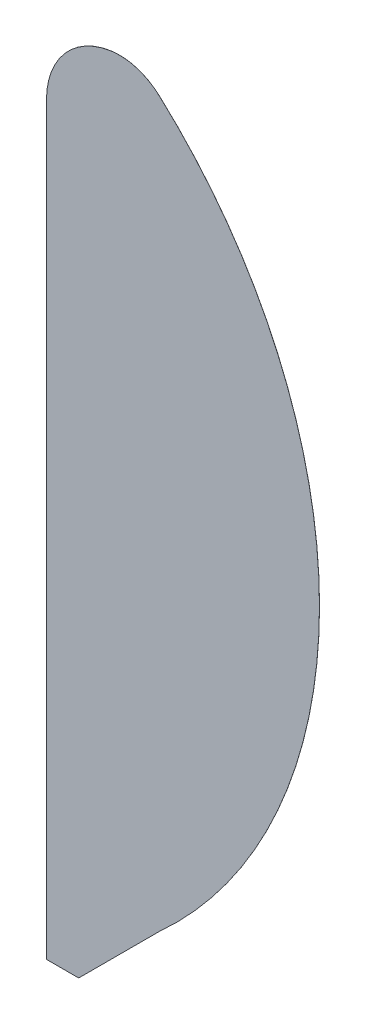
ISO-10303-21;
HEADER;
FILE_DESCRIPTION(('STEP AP214'),'2;1');
FILE_NAME('part.step','',(''),(''),'','','');
FILE_SCHEMA(('AUTOMOTIVE_DESIGN { 1 0 10303 214 1 1 1 1 }'));
ENDSEC;
DATA;
#1=APPLICATION_CONTEXT('core data for automotive mechanical design processes');
#2=APPLICATION_PROTOCOL_DEFINITION('international standard','automotive_design',2000,#1);
#3=PRODUCT_CONTEXT('',#1,'mechanical');
#4=PRODUCT('Part','Part','',(#3));
#5=PRODUCT_RELATED_PRODUCT_CATEGORY('part','',(#4));
#6=PRODUCT_DEFINITION_FORMATION('','',#4);
#7=PRODUCT_DEFINITION_CONTEXT('part definition',#1,'design');
#8=PRODUCT_DEFINITION('design','',#6,#7);
#9=PRODUCT_DEFINITION_SHAPE('','',#8);
#10=(LENGTH_UNIT() NAMED_UNIT(*) SI_UNIT(.MILLI.,.METRE.));
#11=(NAMED_UNIT(*) PLANE_ANGLE_UNIT() SI_UNIT($,.RADIAN.));
#12=(NAMED_UNIT(*) SI_UNIT($,.STERADIAN.) SOLID_ANGLE_UNIT());
#13=UNCERTAINTY_MEASURE_WITH_UNIT(LENGTH_MEASURE(1.E-05),#10,'distance_accuracy_value','');
#14=(GEOMETRIC_REPRESENTATION_CONTEXT(3) GLOBAL_UNCERTAINTY_ASSIGNED_CONTEXT((#13)) GLOBAL_UNIT_ASSIGNED_CONTEXT((#10,
#11,#12)) REPRESENTATION_CONTEXT('',''));
#15=CARTESIAN_POINT('',(0.,0.,0.));
#16=DIRECTION('',(0.,0.,1.));
#17=DIRECTION('',(1.,0.,0.));
#18=AXIS2_PLACEMENT_3D('',#15,#16,#17);
#19=CARTESIAN_POINT('',(0.,0.,0.01));
#20=DIRECTION('',(0.,1.,0.));
#21=DIRECTION('',(-1.,0.,0.));
#22=AXIS2_PLACEMENT_3D('',#19,#20,#21);
#23=PLANE('',#22);
#24=DIRECTION('',(1.,0.,0.));
#25=VECTOR('',#24,1.);
#26=CARTESIAN_POINT('',(0.,0.,0.));
#27=LINE('',#26,#25);
#28=CARTESIAN_POINT('',(0.,0.,0.));
#29=VERTEX_POINT('',#28);
#30=CARTESIAN_POINT('',(5.,0.,0.));
#31=VERTEX_POINT('',#30);
#32=EDGE_CURVE('E122',#29,#31,#27,.T.);
#33=ORIENTED_EDGE('',*,*,#32,.T.);
#34=DIRECTION('',(0.,0.,-1.));
#35=VECTOR('',#34,1.);
#36=CARTESIAN_POINT('',(5.,0.,0.01));
#37=LINE('',#36,#35);
#38=CARTESIAN_POINT('',(5.,0.,0.01));
#39=VERTEX_POINT('',#38);
#40=EDGE_CURVE('E11',#39,#31,#37,.T.);
#41=ORIENTED_EDGE('',*,*,#40,.F.);
#42=DIRECTION('',(1.,0.,0.));
#43=VECTOR('',#42,1.);
#44=CARTESIAN_POINT('',(0.,0.,0.01));
#45=LINE('',#44,#43);
#46=CARTESIAN_POINT('',(0.,0.,0.01));
#47=VERTEX_POINT('',#46);
#48=EDGE_CURVE('E136',#47,#39,#45,.T.);
#49=ORIENTED_EDGE('',*,*,#48,.F.);
#50=DIRECTION('',(0.,0.,-1.));
#51=VECTOR('',#50,1.);
#52=CARTESIAN_POINT('',(0.,0.,0.01));
#53=LINE('',#52,#51);
#54=EDGE_CURVE('E60',#47,#29,#53,.T.);
#55=ORIENTED_EDGE('',*,*,#54,.T.);
#56=EDGE_LOOP('',(#33,#41,#49,#55));
#57=FACE_BOUND('',#56,.T.);
#58=ADVANCED_FACE('F41',(#57),#23,.F.);
#59=CARTESIAN_POINT('',(5.,0.,0.01));
#60=DIRECTION('',(-0.707106781186547,0.707106781186547,0.));
#61=DIRECTION('',(-0.707106781186548,-0.707106781186548,0.));
#62=AXIS2_PLACEMENT_3D('',#59,#60,#61);
#63=PLANE('',#62);
#64=DIRECTION('',(0.707106781186547,0.707106781186547,0.));
#65=VECTOR('',#64,1.);
#66=CARTESIAN_POINT('',(5.,0.,0.));
#67=LINE('',#66,#65);
#68=CARTESIAN_POINT('',(17.5,12.5,0.));
#69=VERTEX_POINT('',#68);
#70=EDGE_CURVE('E130',#31,#69,#67,.T.);
#71=ORIENTED_EDGE('',*,*,#70,.T.);
#72=DIRECTION('',(0.,0.,-1.));
#73=VECTOR('',#72,1.);
#74=CARTESIAN_POINT('',(17.5,12.5,0.01));
#75=LINE('',#74,#73);
#76=CARTESIAN_POINT('',(17.5,12.5,0.01));
#77=VERTEX_POINT('',#76);
#78=EDGE_CURVE('E47',#77,#69,#75,.T.);
#79=ORIENTED_EDGE('',*,*,#78,.F.);
#80=DIRECTION('',(0.707106781186547,0.707106781186547,0.));
#81=VECTOR('',#80,1.);
#82=CARTESIAN_POINT('',(5.,0.,0.01));
#83=LINE('',#82,#81);
#84=EDGE_CURVE('E90',#39,#77,#83,.T.);
#85=ORIENTED_EDGE('',*,*,#84,.F.);
#86=ORIENTED_EDGE('',*,*,#40,.T.);
#87=EDGE_LOOP('',(#71,#79,#85,#86));
#88=FACE_BOUND('',#87,.T.);
#89=ADVANCED_FACE('F158',(#88),#63,.F.);
#90=CARTESIAN_POINT('',(-33.459002090219,68.6039946432098,0.01));
#91=DIRECTION('',(0.,0.,-1.));
#92=DIRECTION('',(-1.,0.,0.));
#93=AXIS2_PLACEMENT_3D('',#90,#91,#92);
#94=CYLINDRICAL_SURFACE('',#93,75.7923354235523);
#95=CARTESIAN_POINT('',(-33.459002090219,68.6039946432098,0.));
#96=DIRECTION('',(0.,0.,1.));
#97=DIRECTION('',(1.,0.,0.));
#98=AXIS2_PLACEMENT_3D('',#95,#96,#97);
#99=CIRCLE('',#98,75.7923354235523);
#100=CARTESIAN_POINT('',(17.5,124.70798928642,0.));
#101=VERTEX_POINT('',#100);
#102=EDGE_CURVE('E129',#69,#101,#99,.T.);
#103=ORIENTED_EDGE('',*,*,#102,.T.);
#104=DIRECTION('',(0.,0.,-1.));
#105=VECTOR('',#104,1.);
#106=CARTESIAN_POINT('',(17.5,124.70798928642,0.01));
#107=LINE('',#106,#105);
#108=CARTESIAN_POINT('',(17.5,124.70798928642,0.01));
#109=VERTEX_POINT('',#108);
#110=EDGE_CURVE('E107',#109,#101,#107,.T.);
#111=ORIENTED_EDGE('',*,*,#110,.F.);
#112=CARTESIAN_POINT('',(-33.459002090219,68.6039946432098,0.01));
#113=DIRECTION('',(0.,0.,1.));
#114=DIRECTION('',(1.,0.,0.));
#115=AXIS2_PLACEMENT_3D('',#112,#113,#114);
#116=CIRCLE('',#115,75.7923354235523);
#117=EDGE_CURVE('E119',#77,#109,#116,.T.);
#118=ORIENTED_EDGE('',*,*,#117,.F.);
#119=ORIENTED_EDGE('',*,*,#78,.T.);
#120=EDGE_LOOP('',(#103,#111,#118,#119));
#121=FACE_BOUND('',#120,.T.);
#122=ADVANCED_FACE('F145',(#121),#94,.T.);
#123=CARTESIAN_POINT('',(11.3207251658232,117.904834044451,0.01));
#124=DIRECTION('',(0.,0.,-1.));
#125=DIRECTION('',(-1.,0.,0.));
#126=AXIS2_PLACEMENT_3D('',#123,#124,#125);
#127=CYLINDRICAL_SURFACE('',#126,9.19055812900496);
#128=CARTESIAN_POINT('',(11.3207251658232,117.904834044451,0.));
#129=DIRECTION('',(0.,0.,-1.));
#130=DIRECTION('',(-1.,0.,0.));
#131=AXIS2_PLACEMENT_3D('',#128,#129,#130);
#132=CIRCLE('',#131,9.19055812900496);
#133=CARTESIAN_POINT('',(10.,127.,0.));
#134=VERTEX_POINT('',#133);
#135=EDGE_CURVE('E102',#134,#101,#132,.T.);
#136=ORIENTED_EDGE('',*,*,#135,.F.);
#137=DIRECTION('',(0.,0.,-1.));
#138=VECTOR('',#137,1.);
#139=CARTESIAN_POINT('',(10.,127.,0.01));
#140=LINE('',#139,#138);
#141=CARTESIAN_POINT('',(10.,127.,0.01));
#142=VERTEX_POINT('',#141);
#143=EDGE_CURVE('E97',#142,#134,#140,.T.);
#144=ORIENTED_EDGE('',*,*,#143,.F.);
#145=CARTESIAN_POINT('',(11.3207251658232,117.904834044451,0.01));
#146=DIRECTION('',(0.,0.,-1.));
#147=DIRECTION('',(-1.,0.,0.));
#148=AXIS2_PLACEMENT_3D('',#145,#146,#147);
#149=CIRCLE('',#148,9.19055812900496);
#150=EDGE_CURVE('E105',#142,#109,#149,.T.);
#151=ORIENTED_EDGE('',*,*,#150,.T.);
#152=ORIENTED_EDGE('',*,*,#110,.T.);
#153=EDGE_LOOP('',(#136,#144,#151,#152));
#154=FACE_BOUND('',#153,.T.);
#155=ADVANCED_FACE('F101',(#154),#127,.T.);
#156=CARTESIAN_POINT('',(11.67821245,115.443,0.01));
#157=DIRECTION('',(0.,0.,-1.));
#158=DIRECTION('',(-1.,0.,0.));
#159=AXIS2_PLACEMENT_3D('',#156,#157,#158);
#160=CYLINDRICAL_SURFACE('',#159,11.67821245);
#161=CARTESIAN_POINT('',(11.67821245,115.443,0.));
#162=DIRECTION('',(0.,0.,-1.));
#163=DIRECTION('',(-1.,0.,0.));
#164=AXIS2_PLACEMENT_3D('',#161,#162,#163);
#165=CIRCLE('',#164,11.67821245);
#166=CARTESIAN_POINT('',(0.,115.443,0.));
#167=VERTEX_POINT('',#166);
#168=EDGE_CURVE('E135',#167,#134,#165,.T.);
#169=ORIENTED_EDGE('',*,*,#168,.F.);
#170=DIRECTION('',(0.,0.,-1.));
#171=VECTOR('',#170,1.);
#172=CARTESIAN_POINT('',(0.,115.443,0.01));
#173=LINE('',#172,#171);
#174=CARTESIAN_POINT('',(0.,115.443,0.01));
#175=VERTEX_POINT('',#174);
#176=EDGE_CURVE('E76',#175,#167,#173,.T.);
#177=ORIENTED_EDGE('',*,*,#176,.F.);
#178=CARTESIAN_POINT('',(11.67821245,115.443,0.01));
#179=DIRECTION('',(0.,0.,-1.));
#180=DIRECTION('',(-1.,0.,0.));
#181=AXIS2_PLACEMENT_3D('',#178,#179,#180);
#182=CIRCLE('',#181,11.67821245);
#183=EDGE_CURVE('E111',#175,#142,#182,.T.);
#184=ORIENTED_EDGE('',*,*,#183,.T.);
#185=ORIENTED_EDGE('',*,*,#143,.T.);
#186=EDGE_LOOP('',(#169,#177,#184,#185));
#187=FACE_BOUND('',#186,.T.);
#188=ADVANCED_FACE('F118',(#187),#160,.T.);
#189=CARTESIAN_POINT('',(0.,0.,0.01));
#190=DIRECTION('',(-1.,0.,0.));
#191=DIRECTION('',(0.,-1.,0.));
#192=AXIS2_PLACEMENT_3D('',#189,#190,#191);
#193=PLANE('',#192);
#194=DIRECTION('',(0.,1.,0.));
#195=VECTOR('',#194,1.);
#196=CARTESIAN_POINT('',(0.,0.,0.));
#197=LINE('',#196,#195);
#198=EDGE_CURVE('E132',#29,#167,#197,.T.);
#199=ORIENTED_EDGE('',*,*,#198,.F.);
#200=ORIENTED_EDGE('',*,*,#54,.F.);
#201=DIRECTION('',(0.,1.,0.));
#202=VECTOR('',#201,1.);
#203=CARTESIAN_POINT('',(0.,0.,0.01));
#204=LINE('',#203,#202);
#205=EDGE_CURVE('E117',#47,#175,#204,.T.);
#206=ORIENTED_EDGE('',*,*,#205,.T.);
#207=ORIENTED_EDGE('',*,*,#176,.T.);
#208=EDGE_LOOP('',(#199,#200,#206,#207));
#209=FACE_BOUND('',#208,.T.);
#210=ADVANCED_FACE('F150',(#209),#193,.T.);
#211=CARTESIAN_POINT('',(-33.459002090219,68.6039946432098,0.01));
#212=DIRECTION('',(0.,0.,1.));
#213=DIRECTION('',(1.,0.,0.));
#214=AXIS2_PLACEMENT_3D('',#211,#212,#213);
#215=PLANE('',#214);
#216=ORIENTED_EDGE('',*,*,#48,.T.);
#217=ORIENTED_EDGE('',*,*,#84,.T.);
#218=ORIENTED_EDGE('',*,*,#117,.T.);
#219=ORIENTED_EDGE('',*,*,#150,.F.);
#220=ORIENTED_EDGE('',*,*,#183,.F.);
#221=ORIENTED_EDGE('',*,*,#205,.F.);
#222=EDGE_LOOP('',(#216,#217,#218,#219,#220,#221));
#223=FACE_BOUND('',#222,.T.);
#224=ADVANCED_FACE('F115',(#223),#215,.T.);
#225=CARTESIAN_POINT('',(-33.459002090219,68.6039946432098,0.));
#226=DIRECTION('',(0.,0.,1.));
#227=DIRECTION('',(1.,0.,0.));
#228=AXIS2_PLACEMENT_3D('',#225,#226,#227);
#229=PLANE('',#228);
#230=ORIENTED_EDGE('',*,*,#32,.F.);
#231=ORIENTED_EDGE('',*,*,#198,.T.);
#232=ORIENTED_EDGE('',*,*,#168,.T.);
#233=ORIENTED_EDGE('',*,*,#135,.T.);
#234=ORIENTED_EDGE('',*,*,#102,.F.);
#235=ORIENTED_EDGE('',*,*,#70,.F.);
#236=EDGE_LOOP('',(#230,#231,#232,#233,#234,#235));
#237=FACE_BOUND('',#236,.T.);
#238=ADVANCED_FACE('F148',(#237),#229,.F.);
#239=CLOSED_SHELL('',(#58,#89,#122,#155,#188,#210,#224,#238));
#240=MANIFOLD_SOLID_BREP('B2',#239);
#241=ADVANCED_BREP_SHAPE_REPRESENTATION('',(#18,#240),#14);
#242=SHAPE_DEFINITION_REPRESENTATION(#9,#241);
ENDSEC;
END-ISO-10303-21;
